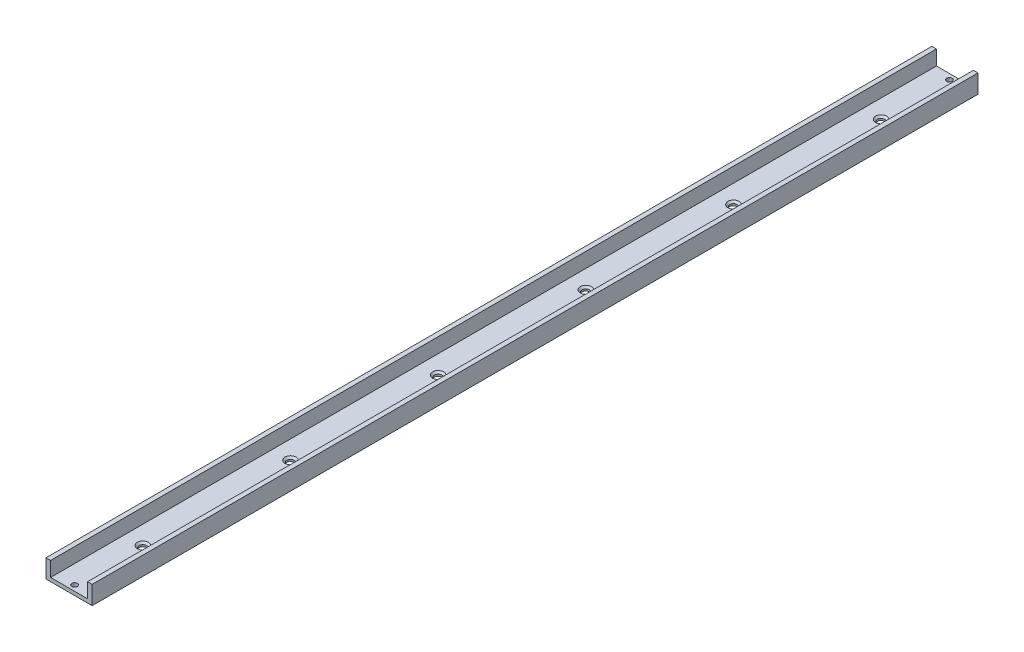
ISO-10303-21;
HEADER;
FILE_DESCRIPTION(('STEP AP214'),'2;1');
FILE_NAME('part.step','',(''),(''),'','','');
FILE_SCHEMA(('AUTOMOTIVE_DESIGN { 1 0 10303 214 1 1 1 1 }'));
ENDSEC;
DATA;
#1=APPLICATION_CONTEXT('core data for automotive mechanical design processes');
#2=APPLICATION_PROTOCOL_DEFINITION('international standard','automotive_design',2000,#1);
#3=PRODUCT_CONTEXT('',#1,'mechanical');
#4=PRODUCT('Part','Part','',(#3));
#5=PRODUCT_RELATED_PRODUCT_CATEGORY('part','',(#4));
#6=PRODUCT_DEFINITION_FORMATION('','',#4);
#7=PRODUCT_DEFINITION_CONTEXT('part definition',#1,'design');
#8=PRODUCT_DEFINITION('design','',#6,#7);
#9=PRODUCT_DEFINITION_SHAPE('','',#8);
#10=(LENGTH_UNIT() NAMED_UNIT(*) SI_UNIT(.MILLI.,.METRE.));
#11=(NAMED_UNIT(*) PLANE_ANGLE_UNIT() SI_UNIT($,.RADIAN.));
#12=(NAMED_UNIT(*) SI_UNIT($,.STERADIAN.) SOLID_ANGLE_UNIT());
#13=UNCERTAINTY_MEASURE_WITH_UNIT(LENGTH_MEASURE(1.E-05),#10,'distance_accuracy_value','');
#14=(GEOMETRIC_REPRESENTATION_CONTEXT(3) GLOBAL_UNCERTAINTY_ASSIGNED_CONTEXT((#13)) GLOBAL_UNIT_ASSIGNED_CONTEXT((#10,
#11,#12)) REPRESENTATION_CONTEXT('',''));
#15=CARTESIAN_POINT('',(0.,0.,0.));
#16=DIRECTION('',(0.,0.,1.));
#17=DIRECTION('',(1.,0.,0.));
#18=AXIS2_PLACEMENT_3D('',#15,#16,#17);
#19=CARTESIAN_POINT('',(0.,0.,480.));
#20=DIRECTION('',(-1.,0.,0.));
#21=DIRECTION('',(0.,0.,1.));
#22=AXIS2_PLACEMENT_3D('',#19,#20,#21);
#23=PLANE('',#22);
#24=DIRECTION('',(0.,1.,0.));
#25=VECTOR('',#24,1.);
#26=CARTESIAN_POINT('',(0.,0.,0.));
#27=LINE('',#26,#25);
#28=CARTESIAN_POINT('',(0.,0.,0.));
#29=VERTEX_POINT('',#28);
#30=CARTESIAN_POINT('',(0.,8.,0.));
#31=VERTEX_POINT('',#30);
#32=EDGE_CURVE('E151',#29,#31,#27,.T.);
#33=ORIENTED_EDGE('',*,*,#32,.T.);
#34=DIRECTION('',(0.,0.,-1.));
#35=VECTOR('',#34,1.);
#36=CARTESIAN_POINT('',(0.,8.,480.));
#37=LINE('',#36,#35);
#38=CARTESIAN_POINT('',(0.,8.,480.));
#39=VERTEX_POINT('',#38);
#40=EDGE_CURVE('E193',#39,#31,#37,.T.);
#41=ORIENTED_EDGE('',*,*,#40,.F.);
#42=DIRECTION('',(0.,1.,0.));
#43=VECTOR('',#42,1.);
#44=CARTESIAN_POINT('',(0.,0.,480.));
#45=LINE('',#44,#43);
#46=CARTESIAN_POINT('',(0.,0.,480.));
#47=VERTEX_POINT('',#46);
#48=EDGE_CURVE('E174',#47,#39,#45,.T.);
#49=ORIENTED_EDGE('',*,*,#48,.F.);
#50=DIRECTION('',(0.,0.,-1.));
#51=VECTOR('',#50,1.);
#52=CARTESIAN_POINT('',(0.,0.,480.));
#53=LINE('',#52,#51);
#54=EDGE_CURVE('E147',#47,#29,#53,.T.);
#55=ORIENTED_EDGE('',*,*,#54,.T.);
#56=EDGE_LOOP('',(#33,#41,#49,#55));
#57=FACE_BOUND('',#56,.T.);
#58=ADVANCED_FACE('F47',(#57),#23,.F.);
#59=CARTESIAN_POINT('',(0.,8.,480.));
#60=DIRECTION('',(0.,-1.,0.));
#61=DIRECTION('',(0.,0.,-1.));
#62=AXIS2_PLACEMENT_3D('',#59,#60,#61);
#63=PLANE('',#62);
#64=DIRECTION('',(-1.,0.,0.));
#65=VECTOR('',#64,1.);
#66=CARTESIAN_POINT('',(0.,8.,0.));
#67=LINE('',#66,#65);
#68=CARTESIAN_POINT('',(-2.5,8.,0.));
#69=VERTEX_POINT('',#68);
#70=EDGE_CURVE('E155',#31,#69,#67,.T.);
#71=ORIENTED_EDGE('',*,*,#70,.T.);
#72=DIRECTION('',(0.,0.,-1.));
#73=VECTOR('',#72,1.);
#74=CARTESIAN_POINT('',(-2.5,8.,480.));
#75=LINE('',#74,#73);
#76=CARTESIAN_POINT('',(-2.5,8.,480.));
#77=VERTEX_POINT('',#76);
#78=EDGE_CURVE('E189',#77,#69,#75,.T.);
#79=ORIENTED_EDGE('',*,*,#78,.F.);
#80=DIRECTION('',(-1.,0.,0.));
#81=VECTOR('',#80,1.);
#82=CARTESIAN_POINT('',(0.,8.,480.));
#83=LINE('',#82,#81);
#84=EDGE_CURVE('E110',#39,#77,#83,.T.);
#85=ORIENTED_EDGE('',*,*,#84,.F.);
#86=ORIENTED_EDGE('',*,*,#40,.T.);
#87=EDGE_LOOP('',(#71,#79,#85,#86));
#88=FACE_BOUND('',#87,.T.);
#89=ADVANCED_FACE('F257',(#88),#63,.F.);
#90=CARTESIAN_POINT('',(-2.5,8.,480.));
#91=DIRECTION('',(1.,0.,0.));
#92=DIRECTION('',(0.,0.,-1.));
#93=AXIS2_PLACEMENT_3D('',#90,#91,#92);
#94=PLANE('',#93);
#95=DIRECTION('',(0.,-1.,0.));
#96=VECTOR('',#95,1.);
#97=CARTESIAN_POINT('',(-2.5,8.,0.));
#98=LINE('',#97,#96);
#99=CARTESIAN_POINT('',(-2.5,-2.,0.));
#100=VERTEX_POINT('',#99);
#101=EDGE_CURVE('E159',#69,#100,#98,.T.);
#102=ORIENTED_EDGE('',*,*,#101,.T.);
#103=DIRECTION('',(0.,0.,-1.));
#104=VECTOR('',#103,1.);
#105=CARTESIAN_POINT('',(-2.5,-2.,480.));
#106=LINE('',#105,#104);
#107=CARTESIAN_POINT('',(-2.5,-2.,480.));
#108=VERTEX_POINT('',#107);
#109=EDGE_CURVE('E185',#108,#100,#106,.T.);
#110=ORIENTED_EDGE('',*,*,#109,.F.);
#111=DIRECTION('',(0.,-1.,0.));
#112=VECTOR('',#111,1.);
#113=CARTESIAN_POINT('',(-2.5,8.,480.));
#114=LINE('',#113,#112);
#115=EDGE_CURVE('E339',#77,#108,#114,.T.);
#116=ORIENTED_EDGE('',*,*,#115,.F.);
#117=ORIENTED_EDGE('',*,*,#78,.T.);
#118=EDGE_LOOP('',(#102,#110,#116,#117));
#119=FACE_BOUND('',#118,.T.);
#120=ADVANCED_FACE('F263',(#119),#94,.F.);
#121=CARTESIAN_POINT('',(-2.5,-2.,480.));
#122=DIRECTION('',(0.,1.,0.));
#123=DIRECTION('',(0.,0.,1.));
#124=AXIS2_PLACEMENT_3D('',#121,#122,#123);
#125=PLANE('',#124);
#126=CARTESIAN_POINT('',(10.0000000000001,-2.,477.));
#127=DIRECTION('',(0.,1.,0.));
#128=DIRECTION('',(0.,0.,1.));
#129=AXIS2_PLACEMENT_3D('',#126,#127,#128);
#130=CIRCLE('',#129,1.5);
#131=CARTESIAN_POINT('',(10.0000000000001,-2.,478.5));
#132=VERTEX_POINT('',#131);
#133=EDGE_CURVE('E156',#132,#132,#130,.T.);
#134=ORIENTED_EDGE('',*,*,#133,.T.);
#135=EDGE_LOOP('',(#134));
#136=FACE_BOUND('',#135,.T.);
#137=CARTESIAN_POINT('',(10.0000000000001,-2.,440.));
#138=DIRECTION('',(0.,1.,0.));
#139=DIRECTION('',(0.,0.,1.));
#140=AXIS2_PLACEMENT_3D('',#137,#138,#139);
#141=CIRCLE('',#140,2.);
#142=CARTESIAN_POINT('',(10.0000000000001,-2.,442.));
#143=VERTEX_POINT('',#142);
#144=EDGE_CURVE('E352',#143,#143,#141,.T.);
#145=ORIENTED_EDGE('',*,*,#144,.T.);
#146=EDGE_LOOP('',(#145));
#147=FACE_BOUND('',#146,.T.);
#148=CARTESIAN_POINT('',(10.,-2.,360.));
#149=DIRECTION('',(0.,1.,0.));
#150=DIRECTION('',(0.,0.,1.));
#151=AXIS2_PLACEMENT_3D('',#148,#149,#150);
#152=CIRCLE('',#151,2.);
#153=CARTESIAN_POINT('',(10.,-2.,362.));
#154=VERTEX_POINT('',#153);
#155=EDGE_CURVE('E317',#154,#154,#152,.T.);
#156=ORIENTED_EDGE('',*,*,#155,.T.);
#157=EDGE_LOOP('',(#156));
#158=FACE_BOUND('',#157,.T.);
#159=CARTESIAN_POINT('',(10.,-2.,280.));
#160=DIRECTION('',(0.,1.,0.));
#161=DIRECTION('',(0.,0.,1.));
#162=AXIS2_PLACEMENT_3D('',#159,#160,#161);
#163=CIRCLE('',#162,2.);
#164=CARTESIAN_POINT('',(10.,-2.,282.));
#165=VERTEX_POINT('',#164);
#166=EDGE_CURVE('E311',#165,#165,#163,.T.);
#167=ORIENTED_EDGE('',*,*,#166,.T.);
#168=EDGE_LOOP('',(#167));
#169=FACE_BOUND('',#168,.T.);
#170=CARTESIAN_POINT('',(10.,-2.,200.));
#171=DIRECTION('',(0.,1.,0.));
#172=DIRECTION('',(0.,0.,1.));
#173=AXIS2_PLACEMENT_3D('',#170,#171,#172);
#174=CIRCLE('',#173,2.);
#175=CARTESIAN_POINT('',(10.,-2.,202.));
#176=VERTEX_POINT('',#175);
#177=EDGE_CURVE('E308',#176,#176,#174,.T.);
#178=ORIENTED_EDGE('',*,*,#177,.T.);
#179=EDGE_LOOP('',(#178));
#180=FACE_BOUND('',#179,.T.);
#181=CARTESIAN_POINT('',(10.,-2.,120.));
#182=DIRECTION('',(0.,1.,0.));
#183=DIRECTION('',(0.,0.,1.));
#184=AXIS2_PLACEMENT_3D('',#181,#182,#183);
#185=CIRCLE('',#184,2.);
#186=CARTESIAN_POINT('',(10.,-2.,122.));
#187=VERTEX_POINT('',#186);
#188=EDGE_CURVE('E312',#187,#187,#185,.T.);
#189=ORIENTED_EDGE('',*,*,#188,.T.);
#190=EDGE_LOOP('',(#189));
#191=FACE_BOUND('',#190,.T.);
#192=CARTESIAN_POINT('',(10.,-2.,40.));
#193=DIRECTION('',(0.,1.,0.));
#194=DIRECTION('',(0.,0.,1.));
#195=AXIS2_PLACEMENT_3D('',#192,#193,#194);
#196=CIRCLE('',#195,2.);
#197=CARTESIAN_POINT('',(10.,-2.,42.));
#198=VERTEX_POINT('',#197);
#199=EDGE_CURVE('E320',#198,#198,#196,.T.);
#200=ORIENTED_EDGE('',*,*,#199,.T.);
#201=EDGE_LOOP('',(#200));
#202=FACE_BOUND('',#201,.T.);
#203=CARTESIAN_POINT('',(10.,-2.,3.));
#204=DIRECTION('',(0.,1.,0.));
#205=DIRECTION('',(0.,0.,1.));
#206=AXIS2_PLACEMENT_3D('',#203,#204,#205);
#207=CIRCLE('',#206,1.5);
#208=CARTESIAN_POINT('',(10.,-2.,4.5));
#209=VERTEX_POINT('',#208);
#210=EDGE_CURVE('E331',#209,#209,#207,.T.);
#211=ORIENTED_EDGE('',*,*,#210,.T.);
#212=EDGE_LOOP('',(#211));
#213=FACE_BOUND('',#212,.T.);
#214=DIRECTION('',(1.,0.,0.));
#215=VECTOR('',#214,1.);
#216=CARTESIAN_POINT('',(-2.5,-2.,0.));
#217=LINE('',#216,#215);
#218=CARTESIAN_POINT('',(22.5,-2.,0.));
#219=VERTEX_POINT('',#218);
#220=EDGE_CURVE('E162',#100,#219,#217,.T.);
#221=ORIENTED_EDGE('',*,*,#220,.T.);
#222=DIRECTION('',(0.,0.,-1.));
#223=VECTOR('',#222,1.);
#224=CARTESIAN_POINT('',(22.5,-2.,480.));
#225=LINE('',#224,#223);
#226=CARTESIAN_POINT('',(22.5,-2.,480.));
#227=VERTEX_POINT('',#226);
#228=EDGE_CURVE('E181',#227,#219,#225,.T.);
#229=ORIENTED_EDGE('',*,*,#228,.F.);
#230=DIRECTION('',(1.,0.,0.));
#231=VECTOR('',#230,1.);
#232=CARTESIAN_POINT('',(-2.5,-2.,480.));
#233=LINE('',#232,#231);
#234=EDGE_CURVE('E342',#108,#227,#233,.T.);
#235=ORIENTED_EDGE('',*,*,#234,.F.);
#236=ORIENTED_EDGE('',*,*,#109,.T.);
#237=EDGE_LOOP('',(#221,#229,#235,#236));
#238=FACE_BOUND('',#237,.T.);
#239=ADVANCED_FACE('F360',(#136,#147,#158,#169,#180,#191,#202,#213,#238),#125,.F.);
#240=CARTESIAN_POINT('',(22.5,-2.,480.));
#241=DIRECTION('',(-1.,0.,0.));
#242=DIRECTION('',(0.,0.,1.));
#243=AXIS2_PLACEMENT_3D('',#240,#241,#242);
#244=PLANE('',#243);
#245=DIRECTION('',(0.,1.,0.));
#246=VECTOR('',#245,1.);
#247=CARTESIAN_POINT('',(22.5,-2.,0.));
#248=LINE('',#247,#246);
#249=CARTESIAN_POINT('',(22.5,8.,0.));
#250=VERTEX_POINT('',#249);
#251=EDGE_CURVE('E165',#219,#250,#248,.T.);
#252=ORIENTED_EDGE('',*,*,#251,.T.);
#253=DIRECTION('',(0.,0.,-1.));
#254=VECTOR('',#253,1.);
#255=CARTESIAN_POINT('',(22.5,8.,480.));
#256=LINE('',#255,#254);
#257=CARTESIAN_POINT('',(22.5,8.,480.));
#258=VERTEX_POINT('',#257);
#259=EDGE_CURVE('E140',#258,#250,#256,.T.);
#260=ORIENTED_EDGE('',*,*,#259,.F.);
#261=DIRECTION('',(0.,1.,0.));
#262=VECTOR('',#261,1.);
#263=CARTESIAN_POINT('',(22.5,-2.,480.));
#264=LINE('',#263,#262);
#265=EDGE_CURVE('E129',#227,#258,#264,.T.);
#266=ORIENTED_EDGE('',*,*,#265,.F.);
#267=ORIENTED_EDGE('',*,*,#228,.T.);
#268=EDGE_LOOP('',(#252,#260,#266,#267));
#269=FACE_BOUND('',#268,.T.);
#270=ADVANCED_FACE('F400',(#269),#244,.F.);
#271=CARTESIAN_POINT('',(22.5,8.,480.));
#272=DIRECTION('',(0.,-1.,0.));
#273=DIRECTION('',(0.,0.,-1.));
#274=AXIS2_PLACEMENT_3D('',#271,#272,#273);
#275=PLANE('',#274);
#276=DIRECTION('',(-1.,0.,0.));
#277=VECTOR('',#276,1.);
#278=CARTESIAN_POINT('',(22.5,8.,0.));
#279=LINE('',#278,#277);
#280=CARTESIAN_POINT('',(20.,8.,0.));
#281=VERTEX_POINT('',#280);
#282=EDGE_CURVE('E138',#250,#281,#279,.T.);
#283=ORIENTED_EDGE('',*,*,#282,.T.);
#284=DIRECTION('',(0.,0.,-1.));
#285=VECTOR('',#284,1.);
#286=CARTESIAN_POINT('',(20.,8.,480.));
#287=LINE('',#286,#285);
#288=CARTESIAN_POINT('',(20.,8.,480.));
#289=VERTEX_POINT('',#288);
#290=EDGE_CURVE('E135',#289,#281,#287,.T.);
#291=ORIENTED_EDGE('',*,*,#290,.F.);
#292=DIRECTION('',(-1.,0.,0.));
#293=VECTOR('',#292,1.);
#294=CARTESIAN_POINT('',(22.5,8.,480.));
#295=LINE('',#294,#293);
#296=EDGE_CURVE('E123',#258,#289,#295,.T.);
#297=ORIENTED_EDGE('',*,*,#296,.F.);
#298=ORIENTED_EDGE('',*,*,#259,.T.);
#299=EDGE_LOOP('',(#283,#291,#297,#298));
#300=FACE_BOUND('',#299,.T.);
#301=ADVANCED_FACE('F136',(#300),#275,.F.);
#302=CARTESIAN_POINT('',(20.,0.,480.));
#303=DIRECTION('',(1.,0.,0.));
#304=DIRECTION('',(0.,0.,-1.));
#305=AXIS2_PLACEMENT_3D('',#302,#303,#304);
#306=PLANE('',#305);
#307=DIRECTION('',(0.,-1.,0.));
#308=VECTOR('',#307,1.);
#309=CARTESIAN_POINT('',(20.,0.,0.));
#310=LINE('',#309,#308);
#311=CARTESIAN_POINT('',(20.,0.,0.));
#312=VERTEX_POINT('',#311);
#313=EDGE_CURVE('E95',#281,#312,#310,.T.);
#314=ORIENTED_EDGE('',*,*,#313,.T.);
#315=DIRECTION('',(0.,0.,-1.));
#316=VECTOR('',#315,1.);
#317=CARTESIAN_POINT('',(20.,0.,480.));
#318=LINE('',#317,#316);
#319=CARTESIAN_POINT('',(20.,0.,480.));
#320=VERTEX_POINT('',#319);
#321=EDGE_CURVE('E141',#320,#312,#318,.T.);
#322=ORIENTED_EDGE('',*,*,#321,.F.);
#323=DIRECTION('',(0.,-1.,0.));
#324=VECTOR('',#323,1.);
#325=CARTESIAN_POINT('',(20.,0.,480.));
#326=LINE('',#325,#324);
#327=EDGE_CURVE('E127',#289,#320,#326,.T.);
#328=ORIENTED_EDGE('',*,*,#327,.F.);
#329=ORIENTED_EDGE('',*,*,#290,.T.);
#330=EDGE_LOOP('',(#314,#322,#328,#329));
#331=FACE_BOUND('',#330,.T.);
#332=ADVANCED_FACE('F143',(#331),#306,.F.);
#333=CARTESIAN_POINT('',(0.,0.,480.));
#334=DIRECTION('',(0.,-1.,0.));
#335=DIRECTION('',(0.,0.,-1.));
#336=AXIS2_PLACEMENT_3D('',#333,#334,#335);
#337=PLANE('',#336);
#338=CARTESIAN_POINT('',(10.,0.,40.));
#339=DIRECTION('',(0.,-1.,0.));
#340=DIRECTION('',(0.,0.,-1.));
#341=AXIS2_PLACEMENT_3D('',#338,#339,#340);
#342=CIRCLE('',#341,3.);
#343=CARTESIAN_POINT('',(10.,0.,37.));
#344=VERTEX_POINT('',#343);
#345=EDGE_CURVE('E220',#344,#344,#342,.T.);
#346=ORIENTED_EDGE('',*,*,#345,.T.);
#347=EDGE_LOOP('',(#346));
#348=FACE_BOUND('',#347,.T.);
#349=CARTESIAN_POINT('',(10.,0.,120.));
#350=DIRECTION('',(0.,-1.,0.));
#351=DIRECTION('',(0.,0.,-1.));
#352=AXIS2_PLACEMENT_3D('',#349,#350,#351);
#353=CIRCLE('',#352,3.);
#354=CARTESIAN_POINT('',(10.,0.,117.));
#355=VERTEX_POINT('',#354);
#356=EDGE_CURVE('E216',#355,#355,#353,.T.);
#357=ORIENTED_EDGE('',*,*,#356,.T.);
#358=EDGE_LOOP('',(#357));
#359=FACE_BOUND('',#358,.T.);
#360=CARTESIAN_POINT('',(10.,0.,200.));
#361=DIRECTION('',(0.,-1.,0.));
#362=DIRECTION('',(0.,0.,-1.));
#363=AXIS2_PLACEMENT_3D('',#360,#361,#362);
#364=CIRCLE('',#363,3.);
#365=CARTESIAN_POINT('',(10.,0.,197.));
#366=VERTEX_POINT('',#365);
#367=EDGE_CURVE('E212',#366,#366,#364,.T.);
#368=ORIENTED_EDGE('',*,*,#367,.T.);
#369=EDGE_LOOP('',(#368));
#370=FACE_BOUND('',#369,.T.);
#371=CARTESIAN_POINT('',(10.,0.,280.));
#372=DIRECTION('',(0.,-1.,0.));
#373=DIRECTION('',(0.,0.,-1.));
#374=AXIS2_PLACEMENT_3D('',#371,#372,#373);
#375=CIRCLE('',#374,3.);
#376=CARTESIAN_POINT('',(10.,0.,277.));
#377=VERTEX_POINT('',#376);
#378=EDGE_CURVE('E208',#377,#377,#375,.T.);
#379=ORIENTED_EDGE('',*,*,#378,.T.);
#380=EDGE_LOOP('',(#379));
#381=FACE_BOUND('',#380,.T.);
#382=CARTESIAN_POINT('',(10.,0.,360.));
#383=DIRECTION('',(0.,-1.,0.));
#384=DIRECTION('',(0.,0.,-1.));
#385=AXIS2_PLACEMENT_3D('',#382,#383,#384);
#386=CIRCLE('',#385,3.);
#387=CARTESIAN_POINT('',(10.,0.,357.));
#388=VERTEX_POINT('',#387);
#389=EDGE_CURVE('E204',#388,#388,#386,.T.);
#390=ORIENTED_EDGE('',*,*,#389,.T.);
#391=EDGE_LOOP('',(#390));
#392=FACE_BOUND('',#391,.T.);
#393=CARTESIAN_POINT('',(10.0000000000001,0.,440.));
#394=DIRECTION('',(0.,-1.,0.));
#395=DIRECTION('',(0.,0.,-1.));
#396=AXIS2_PLACEMENT_3D('',#393,#394,#395);
#397=CIRCLE('',#396,3.);
#398=CARTESIAN_POINT('',(10.0000000000001,0.,437.));
#399=VERTEX_POINT('',#398);
#400=EDGE_CURVE('E200',#399,#399,#397,.T.);
#401=ORIENTED_EDGE('',*,*,#400,.T.);
#402=EDGE_LOOP('',(#401));
#403=FACE_BOUND('',#402,.T.);
#404=CARTESIAN_POINT('',(10.0000000000001,0.,477.));
#405=DIRECTION('',(0.,1.,0.));
#406=DIRECTION('',(0.,0.,1.));
#407=AXIS2_PLACEMENT_3D('',#404,#405,#406);
#408=CIRCLE('',#407,1.5);
#409=CARTESIAN_POINT('',(10.0000000000001,0.,478.5));
#410=VERTEX_POINT('',#409);
#411=EDGE_CURVE('E348',#410,#410,#408,.T.);
#412=ORIENTED_EDGE('',*,*,#411,.F.);
#413=EDGE_LOOP('',(#412));
#414=FACE_BOUND('',#413,.T.);
#415=CARTESIAN_POINT('',(10.,0.,3.));
#416=DIRECTION('',(0.,1.,0.));
#417=DIRECTION('',(0.,0.,1.));
#418=AXIS2_PLACEMENT_3D('',#415,#416,#417);
#419=CIRCLE('',#418,1.5);
#420=CARTESIAN_POINT('',(10.,0.,4.5));
#421=VERTEX_POINT('',#420);
#422=EDGE_CURVE('E327',#421,#421,#419,.T.);
#423=ORIENTED_EDGE('',*,*,#422,.F.);
#424=EDGE_LOOP('',(#423));
#425=FACE_BOUND('',#424,.T.);
#426=DIRECTION('',(-1.,0.,0.));
#427=VECTOR('',#426,1.);
#428=CARTESIAN_POINT('',(0.,0.,0.));
#429=LINE('',#428,#427);
#430=EDGE_CURVE('E101',#312,#29,#429,.T.);
#431=ORIENTED_EDGE('',*,*,#430,.T.);
#432=ORIENTED_EDGE('',*,*,#54,.F.);
#433=DIRECTION('',(-1.,0.,0.));
#434=VECTOR('',#433,1.);
#435=CARTESIAN_POINT('',(0.,0.,480.));
#436=LINE('',#435,#434);
#437=EDGE_CURVE('E66',#320,#47,#436,.T.);
#438=ORIENTED_EDGE('',*,*,#437,.F.);
#439=ORIENTED_EDGE('',*,*,#321,.T.);
#440=EDGE_LOOP('',(#431,#432,#438,#439));
#441=FACE_BOUND('',#440,.T.);
#442=ADVANCED_FACE('F389',(#348,#359,#370,#381,#392,#403,#414,#425,#441),#337,.F.);
#443=CARTESIAN_POINT('',(0.,0.,480.));
#444=DIRECTION('',(0.,0.,1.));
#445=DIRECTION('',(1.,0.,0.));
#446=AXIS2_PLACEMENT_3D('',#443,#444,#445);
#447=PLANE('',#446);
#448=ORIENTED_EDGE('',*,*,#48,.T.);
#449=ORIENTED_EDGE('',*,*,#84,.T.);
#450=ORIENTED_EDGE('',*,*,#115,.T.);
#451=ORIENTED_EDGE('',*,*,#234,.T.);
#452=ORIENTED_EDGE('',*,*,#265,.T.);
#453=ORIENTED_EDGE('',*,*,#296,.T.);
#454=ORIENTED_EDGE('',*,*,#327,.T.);
#455=ORIENTED_EDGE('',*,*,#437,.T.);
#456=EDGE_LOOP('',(#448,#449,#450,#451,#452,#453,#454,#455));
#457=FACE_BOUND('',#456,.T.);
#458=ADVANCED_FACE('F125',(#457),#447,.T.);
#459=CARTESIAN_POINT('',(0.,0.,0.));
#460=DIRECTION('',(0.,0.,1.));
#461=DIRECTION('',(1.,0.,0.));
#462=AXIS2_PLACEMENT_3D('',#459,#460,#461);
#463=PLANE('',#462);
#464=ORIENTED_EDGE('',*,*,#32,.F.);
#465=ORIENTED_EDGE('',*,*,#430,.F.);
#466=ORIENTED_EDGE('',*,*,#313,.F.);
#467=ORIENTED_EDGE('',*,*,#282,.F.);
#468=ORIENTED_EDGE('',*,*,#251,.F.);
#469=ORIENTED_EDGE('',*,*,#220,.F.);
#470=ORIENTED_EDGE('',*,*,#101,.F.);
#471=ORIENTED_EDGE('',*,*,#70,.F.);
#472=EDGE_LOOP('',(#464,#465,#466,#467,#468,#469,#470,#471));
#473=FACE_BOUND('',#472,.T.);
#474=ADVANCED_FACE('F385',(#473),#463,.F.);
#475=CARTESIAN_POINT('',(10.,-2.,3.));
#476=DIRECTION('',(0.,1.,0.));
#477=DIRECTION('',(0.,0.,1.));
#478=AXIS2_PLACEMENT_3D('',#475,#476,#477);
#479=CYLINDRICAL_SURFACE('',#478,1.5);
#480=ORIENTED_EDGE('',*,*,#210,.F.);
#481=EDGE_LOOP('',(#480));
#482=FACE_BOUND('',#481,.T.);
#483=ORIENTED_EDGE('',*,*,#422,.T.);
#484=EDGE_LOOP('',(#483));
#485=FACE_BOUND('',#484,.T.);
#486=ADVANCED_FACE('F381',(#482,#485),#479,.F.);
#487=CARTESIAN_POINT('',(10.,-2.,40.));
#488=DIRECTION('',(0.,1.,0.));
#489=DIRECTION('',(0.,0.,1.));
#490=AXIS2_PLACEMENT_3D('',#487,#488,#489);
#491=CYLINDRICAL_SURFACE('',#490,2.);
#492=CARTESIAN_POINT('',(10.,-0.999999999999956,40.));
#493=DIRECTION('',(0.,-1.,0.));
#494=DIRECTION('',(0.,0.,-1.));
#495=AXIS2_PLACEMENT_3D('',#492,#493,#494);
#496=CIRCLE('',#495,2.);
#497=CARTESIAN_POINT('',(10.,-0.999999999999956,38.));
#498=VERTEX_POINT('',#497);
#499=EDGE_CURVE('E196',#498,#498,#496,.F.);
#500=ORIENTED_EDGE('',*,*,#499,.T.);
#501=EDGE_LOOP('',(#500));
#502=FACE_BOUND('',#501,.T.);
#503=ORIENTED_EDGE('',*,*,#199,.F.);
#504=EDGE_LOOP('',(#503));
#505=FACE_BOUND('',#504,.T.);
#506=ADVANCED_FACE('F377',(#502,#505),#491,.F.);
#507=CARTESIAN_POINT('',(10.,-2.,120.));
#508=DIRECTION('',(0.,1.,0.));
#509=DIRECTION('',(0.,0.,1.));
#510=AXIS2_PLACEMENT_3D('',#507,#508,#509);
#511=CYLINDRICAL_SURFACE('',#510,2.);
#512=CARTESIAN_POINT('',(10.,-0.999999999999956,120.));
#513=DIRECTION('',(0.,-1.,0.));
#514=DIRECTION('',(0.,0.,-1.));
#515=AXIS2_PLACEMENT_3D('',#512,#513,#514);
#516=CIRCLE('',#515,2.);
#517=CARTESIAN_POINT('',(10.,-0.999999999999956,118.));
#518=VERTEX_POINT('',#517);
#519=EDGE_CURVE('E224',#518,#518,#516,.F.);
#520=ORIENTED_EDGE('',*,*,#519,.T.);
#521=EDGE_LOOP('',(#520));
#522=FACE_BOUND('',#521,.T.);
#523=ORIENTED_EDGE('',*,*,#188,.F.);
#524=EDGE_LOOP('',(#523));
#525=FACE_BOUND('',#524,.T.);
#526=ADVANCED_FACE('F304',(#522,#525),#511,.F.);
#527=CARTESIAN_POINT('',(10.,-2.,200.));
#528=DIRECTION('',(0.,1.,0.));
#529=DIRECTION('',(0.,0.,1.));
#530=AXIS2_PLACEMENT_3D('',#527,#528,#529);
#531=CYLINDRICAL_SURFACE('',#530,2.);
#532=CARTESIAN_POINT('',(10.,-0.999999999999956,200.));
#533=DIRECTION('',(0.,-1.,0.));
#534=DIRECTION('',(0.,0.,-1.));
#535=AXIS2_PLACEMENT_3D('',#532,#533,#534);
#536=CIRCLE('',#535,2.);
#537=CARTESIAN_POINT('',(10.,-0.999999999999956,198.));
#538=VERTEX_POINT('',#537);
#539=EDGE_CURVE('E228',#538,#538,#536,.F.);
#540=ORIENTED_EDGE('',*,*,#539,.T.);
#541=EDGE_LOOP('',(#540));
#542=FACE_BOUND('',#541,.T.);
#543=ORIENTED_EDGE('',*,*,#177,.F.);
#544=EDGE_LOOP('',(#543));
#545=FACE_BOUND('',#544,.T.);
#546=ADVANCED_FACE('F300',(#542,#545),#531,.F.);
#547=CARTESIAN_POINT('',(10.,-2.,280.));
#548=DIRECTION('',(0.,1.,0.));
#549=DIRECTION('',(0.,0.,1.));
#550=AXIS2_PLACEMENT_3D('',#547,#548,#549);
#551=CYLINDRICAL_SURFACE('',#550,2.);
#552=CARTESIAN_POINT('',(10.,-0.999999999999956,280.));
#553=DIRECTION('',(0.,-1.,0.));
#554=DIRECTION('',(0.,0.,-1.));
#555=AXIS2_PLACEMENT_3D('',#552,#553,#554);
#556=CIRCLE('',#555,2.);
#557=CARTESIAN_POINT('',(10.,-0.999999999999956,278.));
#558=VERTEX_POINT('',#557);
#559=EDGE_CURVE('E232',#558,#558,#556,.F.);
#560=ORIENTED_EDGE('',*,*,#559,.T.);
#561=EDGE_LOOP('',(#560));
#562=FACE_BOUND('',#561,.T.);
#563=ORIENTED_EDGE('',*,*,#166,.F.);
#564=EDGE_LOOP('',(#563));
#565=FACE_BOUND('',#564,.T.);
#566=ADVANCED_FACE('F303',(#562,#565),#551,.F.);
#567=CARTESIAN_POINT('',(10.,-2.,360.));
#568=DIRECTION('',(0.,1.,0.));
#569=DIRECTION('',(0.,0.,1.));
#570=AXIS2_PLACEMENT_3D('',#567,#568,#569);
#571=CYLINDRICAL_SURFACE('',#570,2.);
#572=CARTESIAN_POINT('',(10.,-0.999999999999956,360.));
#573=DIRECTION('',(0.,-1.,0.));
#574=DIRECTION('',(0.,0.,-1.));
#575=AXIS2_PLACEMENT_3D('',#572,#573,#574);
#576=CIRCLE('',#575,2.);
#577=CARTESIAN_POINT('',(10.,-0.999999999999956,358.));
#578=VERTEX_POINT('',#577);
#579=EDGE_CURVE('E58',#578,#578,#576,.F.);
#580=ORIENTED_EDGE('',*,*,#579,.T.);
#581=EDGE_LOOP('',(#580));
#582=FACE_BOUND('',#581,.T.);
#583=ORIENTED_EDGE('',*,*,#155,.F.);
#584=EDGE_LOOP('',(#583));
#585=FACE_BOUND('',#584,.T.);
#586=ADVANCED_FACE('F239',(#582,#585),#571,.F.);
#587=CARTESIAN_POINT('',(10.0000000000001,-2.,440.));
#588=DIRECTION('',(0.,1.,0.));
#589=DIRECTION('',(0.,0.,1.));
#590=AXIS2_PLACEMENT_3D('',#587,#588,#589);
#591=CYLINDRICAL_SURFACE('',#590,2.);
#592=CARTESIAN_POINT('',(10.0000000000001,-0.999999999999954,440.));
#593=DIRECTION('',(0.,-1.,0.));
#594=DIRECTION('',(0.,0.,-1.));
#595=AXIS2_PLACEMENT_3D('',#592,#593,#594);
#596=CIRCLE('',#595,2.);
#597=CARTESIAN_POINT('',(10.0000000000001,-0.999999999999954,438.));
#598=VERTEX_POINT('',#597);
#599=EDGE_CURVE('E11',#598,#598,#596,.F.);
#600=ORIENTED_EDGE('',*,*,#599,.T.);
#601=EDGE_LOOP('',(#600));
#602=FACE_BOUND('',#601,.T.);
#603=ORIENTED_EDGE('',*,*,#144,.F.);
#604=EDGE_LOOP('',(#603));
#605=FACE_BOUND('',#604,.T.);
#606=ADVANCED_FACE('F363',(#602,#605),#591,.F.);
#607=CARTESIAN_POINT('',(10.0000000000001,-2.,477.));
#608=DIRECTION('',(0.,1.,0.));
#609=DIRECTION('',(0.,0.,1.));
#610=AXIS2_PLACEMENT_3D('',#607,#608,#609);
#611=CYLINDRICAL_SURFACE('',#610,1.5);
#612=ORIENTED_EDGE('',*,*,#133,.F.);
#613=EDGE_LOOP('',(#612));
#614=FACE_BOUND('',#613,.T.);
#615=ORIENTED_EDGE('',*,*,#411,.T.);
#616=EDGE_LOOP('',(#615));
#617=FACE_BOUND('',#616,.T.);
#618=ADVANCED_FACE('F275',(#614,#617),#611,.F.);
#619=CARTESIAN_POINT('',(10.,-0.999999999999956,40.));
#620=DIRECTION('',(0.,1.,0.));
#621=DIRECTION('',(0.,0.,1.));
#622=AXIS2_PLACEMENT_3D('',#619,#620,#621);
#623=CONICAL_SURFACE('',#622,2.,0.785398163397473);
#624=ORIENTED_EDGE('',*,*,#345,.F.);
#625=EDGE_LOOP('',(#624));
#626=FACE_BOUND('',#625,.T.);
#627=ORIENTED_EDGE('',*,*,#499,.F.);
#628=EDGE_LOOP('',(#627));
#629=FACE_BOUND('',#628,.T.);
#630=ADVANCED_FACE('F268',(#626,#629),#623,.F.);
#631=CARTESIAN_POINT('',(10.,-0.999999999999956,120.));
#632=DIRECTION('',(0.,1.,0.));
#633=DIRECTION('',(0.,0.,1.));
#634=AXIS2_PLACEMENT_3D('',#631,#632,#633);
#635=CONICAL_SURFACE('',#634,2.,0.785398163397473);
#636=ORIENTED_EDGE('',*,*,#356,.F.);
#637=EDGE_LOOP('',(#636));
#638=FACE_BOUND('',#637,.T.);
#639=ORIENTED_EDGE('',*,*,#519,.F.);
#640=EDGE_LOOP('',(#639));
#641=FACE_BOUND('',#640,.T.);
#642=ADVANCED_FACE('F274',(#638,#641),#635,.F.);
#643=CARTESIAN_POINT('',(10.,-0.999999999999956,200.));
#644=DIRECTION('',(0.,1.,0.));
#645=DIRECTION('',(0.,0.,1.));
#646=AXIS2_PLACEMENT_3D('',#643,#644,#645);
#647=CONICAL_SURFACE('',#646,2.,0.785398163397473);
#648=ORIENTED_EDGE('',*,*,#367,.F.);
#649=EDGE_LOOP('',(#648));
#650=FACE_BOUND('',#649,.T.);
#651=ORIENTED_EDGE('',*,*,#539,.F.);
#652=EDGE_LOOP('',(#651));
#653=FACE_BOUND('',#652,.T.);
#654=ADVANCED_FACE('F251',(#650,#653),#647,.F.);
#655=CARTESIAN_POINT('',(10.,-0.999999999999956,280.));
#656=DIRECTION('',(0.,1.,0.));
#657=DIRECTION('',(0.,0.,1.));
#658=AXIS2_PLACEMENT_3D('',#655,#656,#657);
#659=CONICAL_SURFACE('',#658,2.,0.785398163397473);
#660=ORIENTED_EDGE('',*,*,#378,.F.);
#661=EDGE_LOOP('',(#660));
#662=FACE_BOUND('',#661,.T.);
#663=ORIENTED_EDGE('',*,*,#559,.F.);
#664=EDGE_LOOP('',(#663));
#665=FACE_BOUND('',#664,.T.);
#666=ADVANCED_FACE('F244',(#662,#665),#659,.F.);
#667=CARTESIAN_POINT('',(10.,-0.999999999999956,360.));
#668=DIRECTION('',(0.,1.,0.));
#669=DIRECTION('',(0.,0.,1.));
#670=AXIS2_PLACEMENT_3D('',#667,#668,#669);
#671=CONICAL_SURFACE('',#670,2.,0.785398163397473);
#672=ORIENTED_EDGE('',*,*,#389,.F.);
#673=EDGE_LOOP('',(#672));
#674=FACE_BOUND('',#673,.T.);
#675=ORIENTED_EDGE('',*,*,#579,.F.);
#676=EDGE_LOOP('',(#675));
#677=FACE_BOUND('',#676,.T.);
#678=ADVANCED_FACE('F242',(#674,#677),#671,.F.);
#679=CARTESIAN_POINT('',(10.0000000000001,-0.999999999999954,440.));
#680=DIRECTION('',(0.,1.,0.));
#681=DIRECTION('',(0.,0.,1.));
#682=AXIS2_PLACEMENT_3D('',#679,#680,#681);
#683=CONICAL_SURFACE('',#682,2.,0.785398163397473);
#684=ORIENTED_EDGE('',*,*,#400,.F.);
#685=EDGE_LOOP('',(#684));
#686=FACE_BOUND('',#685,.T.);
#687=ORIENTED_EDGE('',*,*,#599,.F.);
#688=EDGE_LOOP('',(#687));
#689=FACE_BOUND('',#688,.T.);
#690=ADVANCED_FACE('F50',(#686,#689),#683,.F.);
#691=CLOSED_SHELL('',(#58,#89,#120,#239,#270,#301,#332,#442,#458,#474,#486,#506,#526,#546,#566,
#586,#606,#618,#630,#642,#654,#666,#678,#690));
#692=MANIFOLD_SOLID_BREP('B2',#691);
#693=ADVANCED_BREP_SHAPE_REPRESENTATION('',(#18,#692),#14);
#694=SHAPE_DEFINITION_REPRESENTATION(#9,#693);
ENDSEC;
END-ISO-10303-21;
